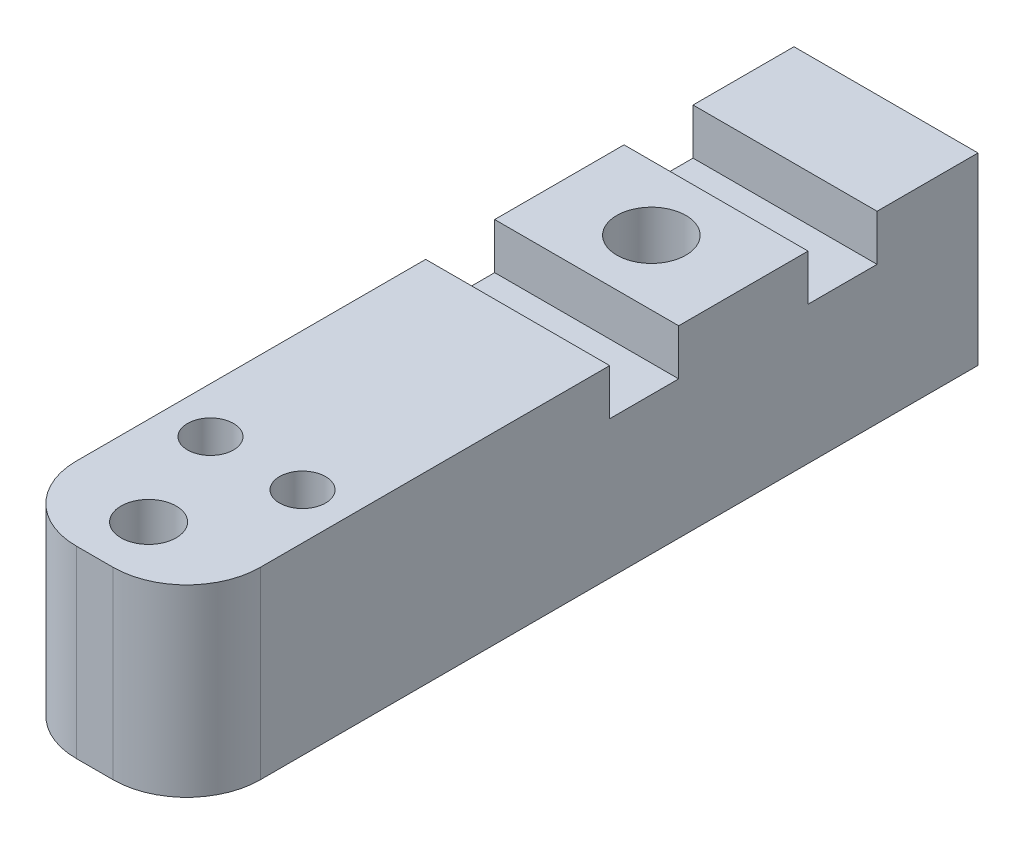
ISO-10303-21;
HEADER;
FILE_DESCRIPTION(('STEP AP214'),'2;1');
FILE_NAME('part.step','',(''),(''),'','','');
FILE_SCHEMA(('AUTOMOTIVE_DESIGN { 1 0 10303 214 1 1 1 1 }'));
ENDSEC;
DATA;
#1=APPLICATION_CONTEXT('core data for automotive mechanical design processes');
#2=APPLICATION_PROTOCOL_DEFINITION('international standard','automotive_design',2000,#1);
#3=PRODUCT_CONTEXT('',#1,'mechanical');
#4=PRODUCT('Part','Part','',(#3));
#5=PRODUCT_RELATED_PRODUCT_CATEGORY('part','',(#4));
#6=PRODUCT_DEFINITION_FORMATION('','',#4);
#7=PRODUCT_DEFINITION_CONTEXT('part definition',#1,'design');
#8=PRODUCT_DEFINITION('design','',#6,#7);
#9=PRODUCT_DEFINITION_SHAPE('','',#8);
#10=(LENGTH_UNIT() NAMED_UNIT(*) SI_UNIT(.MILLI.,.METRE.));
#11=(NAMED_UNIT(*) PLANE_ANGLE_UNIT() SI_UNIT($,.RADIAN.));
#12=(NAMED_UNIT(*) SI_UNIT($,.STERADIAN.) SOLID_ANGLE_UNIT());
#13=UNCERTAINTY_MEASURE_WITH_UNIT(LENGTH_MEASURE(1.E-05),#10,'distance_accuracy_value','');
#14=(GEOMETRIC_REPRESENTATION_CONTEXT(3) GLOBAL_UNCERTAINTY_ASSIGNED_CONTEXT((#13)) GLOBAL_UNIT_ASSIGNED_CONTEXT((#10,
#11,#12)) REPRESENTATION_CONTEXT('',''));
#15=CARTESIAN_POINT('',(0.,0.,0.));
#16=DIRECTION('',(0.,0.,1.));
#17=DIRECTION('',(1.,0.,0.));
#18=AXIS2_PLACEMENT_3D('',#15,#16,#17);
#19=CARTESIAN_POINT('',(-25.4,13.0503448275862,109.22));
#20=DIRECTION('',(0.,-1.,0.));
#21=DIRECTION('',(0.,0.,-1.));
#22=AXIS2_PLACEMENT_3D('',#19,#20,#21);
#23=PLANE('',#22);
#24=DIRECTION('',(0.,0.,-1.));
#25=VECTOR('',#24,1.);
#26=CARTESIAN_POINT('',(-25.4,13.0503448275862,109.22));
#27=LINE('',#26,#25);
#28=CARTESIAN_POINT('',(-25.4,13.0503448275862,13.9325404661232));
#29=VERTEX_POINT('',#28);
#30=CARTESIAN_POINT('',(-25.4,13.0503448275862,0.));
#31=VERTEX_POINT('',#30);
#32=EDGE_CURVE('E213',#29,#31,#27,.T.);
#33=ORIENTED_EDGE('',*,*,#32,.F.);
#34=DIRECTION('',(-1.,0.,0.));
#35=VECTOR('',#34,1.);
#36=CARTESIAN_POINT('',(0.,13.0503448275862,13.9325404661232));
#37=LINE('',#36,#35);
#38=CARTESIAN_POINT('',(0.,13.0503448275862,13.9325404661232));
#39=VERTEX_POINT('',#38);
#40=EDGE_CURVE('E151',#39,#29,#37,.T.);
#41=ORIENTED_EDGE('',*,*,#40,.F.);
#42=DIRECTION('',(0.,0.,-1.));
#43=VECTOR('',#42,1.);
#44=CARTESIAN_POINT('',(0.,13.0503448275862,109.22));
#45=LINE('',#44,#43);
#46=CARTESIAN_POINT('',(0.,13.0503448275862,0.));
#47=VERTEX_POINT('',#46);
#48=EDGE_CURVE('E226',#39,#47,#45,.T.);
#49=ORIENTED_EDGE('',*,*,#48,.T.);
#50=DIRECTION('',(-1.,0.,0.));
#51=VECTOR('',#50,1.);
#52=CARTESIAN_POINT('',(-25.4,13.0503448275862,0.));
#53=LINE('',#52,#51);
#54=EDGE_CURVE('E210',#47,#31,#53,.T.);
#55=ORIENTED_EDGE('',*,*,#54,.T.);
#56=EDGE_LOOP('',(#33,#41,#49,#55));
#57=FACE_BOUND('',#56,.T.);
#58=ADVANCED_FACE('F34',(#57),#23,.F.);
#59=CARTESIAN_POINT('',(-12.7,13.0503448275862,32.385));
#60=DIRECTION('',(0.,1.,0.));
#61=DIRECTION('',(0.,0.,1.));
#62=AXIS2_PLACEMENT_3D('',#59,#60,#61);
#63=CIRCLE('',#62,4.7625);
#64=CARTESIAN_POINT('',(-12.7,13.0503448275862,37.1475));
#65=VERTEX_POINT('',#64);
#66=EDGE_CURVE('E197',#65,#65,#63,.T.);
#67=ORIENTED_EDGE('',*,*,#66,.F.);
#68=EDGE_LOOP('',(#67));
#69=FACE_BOUND('',#68,.T.);
#70=CARTESIAN_POINT('',(0.,13.0503448275862,41.3124595338768));
#71=VERTEX_POINT('',#70);
#72=CARTESIAN_POINT('',(0.,13.0503448275862,23.4575404661232));
#73=VERTEX_POINT('',#72);
#74=EDGE_CURVE('E230',#71,#73,#45,.T.);
#75=ORIENTED_EDGE('',*,*,#74,.T.);
#76=DIRECTION('',(1.,0.,0.));
#77=VECTOR('',#76,1.);
#78=CARTESIAN_POINT('',(-25.4,13.0503448275862,23.4575404661232));
#79=LINE('',#78,#77);
#80=CARTESIAN_POINT('',(-25.4,13.0503448275862,23.4575404661232));
#81=VERTEX_POINT('',#80);
#82=EDGE_CURVE('E185',#81,#73,#79,.T.);
#83=ORIENTED_EDGE('',*,*,#82,.F.);
#84=CARTESIAN_POINT('',(-25.4,13.0503448275862,41.3124595338768));
#85=VERTEX_POINT('',#84);
#86=EDGE_CURVE('E157',#85,#81,#27,.T.);
#87=ORIENTED_EDGE('',*,*,#86,.F.);
#88=DIRECTION('',(-1.,0.,0.));
#89=VECTOR('',#88,1.);
#90=CARTESIAN_POINT('',(-25.4,13.0503448275862,41.3124595338768));
#91=LINE('',#90,#89);
#92=EDGE_CURVE('E178',#71,#85,#91,.T.);
#93=ORIENTED_EDGE('',*,*,#92,.F.);
#94=EDGE_LOOP('',(#75,#83,#87,#93));
#95=FACE_BOUND('',#94,.T.);
#96=ADVANCED_FACE('F270',(#69,#95),#23,.F.);
#97=CARTESIAN_POINT('',(-25.4,13.0503448275862,109.22));
#98=DIRECTION('',(1.,0.,0.));
#99=DIRECTION('',(0.,0.,-1.));
#100=AXIS2_PLACEMENT_3D('',#97,#98,#99);
#101=PLANE('',#100);
#102=DIRECTION('',(0.,0.,-1.));
#103=VECTOR('',#102,1.);
#104=CARTESIAN_POINT('',(-25.4,-12.3496551724138,109.22));
#105=LINE('',#104,#103);
#106=CARTESIAN_POINT('',(-25.4,-12.3496551724138,99.06));
#107=VERTEX_POINT('',#106);
#108=CARTESIAN_POINT('',(-25.4,-12.3496551724138,0.));
#109=VERTEX_POINT('',#108);
#110=EDGE_CURVE('E232',#107,#109,#105,.T.);
#111=ORIENTED_EDGE('',*,*,#110,.F.);
#112=DIRECTION('',(0.,-1.,0.));
#113=VECTOR('',#112,1.);
#114=CARTESIAN_POINT('',(-25.4,13.0503448275862,99.06));
#115=LINE('',#114,#113);
#116=CARTESIAN_POINT('',(-25.4,13.0503448275862,99.06));
#117=VERTEX_POINT('',#116);
#118=EDGE_CURVE('E42',#107,#117,#115,.F.);
#119=ORIENTED_EDGE('',*,*,#118,.T.);
#120=CARTESIAN_POINT('',(-25.4,13.0503448275862,50.8374595338768));
#121=VERTEX_POINT('',#120);
#122=EDGE_CURVE('E224',#117,#121,#27,.T.);
#123=ORIENTED_EDGE('',*,*,#122,.T.);
#124=DIRECTION('',(0.,1.,0.));
#125=VECTOR('',#124,1.);
#126=CARTESIAN_POINT('',(-25.4,6.7003448275862,50.8374595338768));
#127=LINE('',#126,#125);
#128=CARTESIAN_POINT('',(-25.4,6.7003448275862,50.8374595338768));
#129=VERTEX_POINT('',#128);
#130=EDGE_CURVE('E189',#129,#121,#127,.T.);
#131=ORIENTED_EDGE('',*,*,#130,.F.);
#132=DIRECTION('',(0.,0.,1.));
#133=VECTOR('',#132,1.);
#134=CARTESIAN_POINT('',(-25.4,6.7003448275862,50.8374595338768));
#135=LINE('',#134,#133);
#136=CARTESIAN_POINT('',(-25.4,6.7003448275862,41.3124595338768));
#137=VERTEX_POINT('',#136);
#138=EDGE_CURVE('E167',#137,#129,#135,.T.);
#139=ORIENTED_EDGE('',*,*,#138,.F.);
#140=DIRECTION('',(0.,1.,0.));
#141=VECTOR('',#140,1.);
#142=CARTESIAN_POINT('',(-25.4,6.7003448275862,41.3124595338768));
#143=LINE('',#142,#141);
#144=EDGE_CURVE('E177',#137,#85,#143,.T.);
#145=ORIENTED_EDGE('',*,*,#144,.T.);
#146=ORIENTED_EDGE('',*,*,#86,.T.);
#147=DIRECTION('',(0.,1.,0.));
#148=VECTOR('',#147,1.);
#149=CARTESIAN_POINT('',(-25.4,6.7003448275862,23.4575404661232));
#150=LINE('',#149,#148);
#151=CARTESIAN_POINT('',(-25.4,6.7003448275862,23.4575404661232));
#152=VERTEX_POINT('',#151);
#153=EDGE_CURVE('E136',#152,#81,#150,.T.);
#154=ORIENTED_EDGE('',*,*,#153,.F.);
#155=DIRECTION('',(0.,0.,1.));
#156=VECTOR('',#155,1.);
#157=CARTESIAN_POINT('',(-25.4,6.7003448275862,13.9325404661232));
#158=LINE('',#157,#156);
#159=CARTESIAN_POINT('',(-25.4,6.7003448275862,13.9325404661232));
#160=VERTEX_POINT('',#159);
#161=EDGE_CURVE('E143',#160,#152,#158,.T.);
#162=ORIENTED_EDGE('',*,*,#161,.F.);
#163=DIRECTION('',(0.,1.,0.));
#164=VECTOR('',#163,1.);
#165=CARTESIAN_POINT('',(-25.4,6.7003448275862,13.9325404661232));
#166=LINE('',#165,#164);
#167=EDGE_CURVE('E200',#160,#29,#166,.T.);
#168=ORIENTED_EDGE('',*,*,#167,.T.);
#169=ORIENTED_EDGE('',*,*,#32,.T.);
#170=DIRECTION('',(0.,-1.,0.));
#171=VECTOR('',#170,1.);
#172=CARTESIAN_POINT('',(-25.4,13.0503448275862,0.));
#173=LINE('',#172,#171);
#174=EDGE_CURVE('E204',#31,#109,#173,.T.);
#175=ORIENTED_EDGE('',*,*,#174,.T.);
#176=EDGE_LOOP('',(#111,#119,#123,#131,#139,#145,#146,#154,#162,#168,#169,#175));
#177=FACE_BOUND('',#176,.T.);
#178=ADVANCED_FACE('F154',(#177),#101,.F.);
#179=CARTESIAN_POINT('',(-25.4,-12.3496551724138,109.22));
#180=DIRECTION('',(0.,1.,0.));
#181=DIRECTION('',(0.,0.,1.));
#182=AXIS2_PLACEMENT_3D('',#179,#180,#181);
#183=PLANE('',#182);
#184=CARTESIAN_POINT('',(-19.05,-12.3496551724138,86.8843216073793));
#185=DIRECTION('',(0.,1.,0.));
#186=DIRECTION('',(0.,0.,1.));
#187=AXIS2_PLACEMENT_3D('',#184,#185,#186);
#188=CIRCLE('',#187,3.175);
#189=CARTESIAN_POINT('',(-19.05,-12.3496551724138,90.0593216073793));
#190=VERTEX_POINT('',#189);
#191=EDGE_CURVE('E180',#190,#190,#188,.T.);
#192=ORIENTED_EDGE('',*,*,#191,.T.);
#193=EDGE_LOOP('',(#192));
#194=FACE_BOUND('',#193,.T.);
#195=CARTESIAN_POINT('',(-6.35,-12.3496551724138,86.8843216073793));
#196=DIRECTION('',(0.,1.,0.));
#197=DIRECTION('',(0.,0.,1.));
#198=AXIS2_PLACEMENT_3D('',#195,#196,#197);
#199=CIRCLE('',#198,3.175);
#200=CARTESIAN_POINT('',(-6.35,-12.3496551724138,90.0593216073793));
#201=VERTEX_POINT('',#200);
#202=EDGE_CURVE('E302',#201,#201,#199,.T.);
#203=ORIENTED_EDGE('',*,*,#202,.T.);
#204=EDGE_LOOP('',(#203));
#205=FACE_BOUND('',#204,.T.);
#206=CARTESIAN_POINT('',(-12.7,-12.3496551724138,32.385));
#207=DIRECTION('',(0.,1.,0.));
#208=DIRECTION('',(0.,0.,1.));
#209=AXIS2_PLACEMENT_3D('',#206,#207,#208);
#210=CIRCLE('',#209,4.7625);
#211=CARTESIAN_POINT('',(-12.7,-12.3496551724138,37.1475));
#212=VERTEX_POINT('',#211);
#213=EDGE_CURVE('E193',#212,#212,#210,.T.);
#214=ORIENTED_EDGE('',*,*,#213,.T.);
#215=EDGE_LOOP('',(#214));
#216=FACE_BOUND('',#215,.T.);
#217=DIRECTION('',(1.,0.,0.));
#218=VECTOR('',#217,1.);
#219=CARTESIAN_POINT('',(-25.4,-12.3496551724138,109.22));
#220=LINE('',#219,#218);
#221=CARTESIAN_POINT('',(-15.24,-12.3496551724138,109.22));
#222=VERTEX_POINT('',#221);
#223=CARTESIAN_POINT('',(-10.16,-12.3496551724138,109.22));
#224=VERTEX_POINT('',#223);
#225=EDGE_CURVE('E207',#222,#224,#220,.T.);
#226=ORIENTED_EDGE('',*,*,#225,.F.);
#227=CARTESIAN_POINT('',(-15.24,-12.3496551724138,99.06));
#228=DIRECTION('',(0.,1.,0.));
#229=DIRECTION('',(0.,0.,1.));
#230=AXIS2_PLACEMENT_3D('',#227,#228,#229);
#231=CIRCLE('',#230,10.16);
#232=EDGE_CURVE('E56',#222,#107,#231,.F.);
#233=ORIENTED_EDGE('',*,*,#232,.T.);
#234=ORIENTED_EDGE('',*,*,#110,.T.);
#235=DIRECTION('',(1.,0.,0.));
#236=VECTOR('',#235,1.);
#237=CARTESIAN_POINT('',(-25.4,-12.3496551724138,0.));
#238=LINE('',#237,#236);
#239=CARTESIAN_POINT('',(0.,-12.3496551724138,0.));
#240=VERTEX_POINT('',#239);
#241=EDGE_CURVE('E216',#109,#240,#238,.T.);
#242=ORIENTED_EDGE('',*,*,#241,.T.);
#243=DIRECTION('',(0.,0.,-1.));
#244=VECTOR('',#243,1.);
#245=CARTESIAN_POINT('',(0.,-12.3496551724138,109.22));
#246=LINE('',#245,#244);
#247=CARTESIAN_POINT('',(0.,-12.3496551724138,99.06));
#248=VERTEX_POINT('',#247);
#249=EDGE_CURVE('E229',#248,#240,#246,.T.);
#250=ORIENTED_EDGE('',*,*,#249,.F.);
#251=CARTESIAN_POINT('',(-10.16,-12.3496551724138,99.06));
#252=DIRECTION('',(0.,1.,0.));
#253=DIRECTION('',(0.,0.,1.));
#254=AXIS2_PLACEMENT_3D('',#251,#252,#253);
#255=CIRCLE('',#254,10.16);
#256=EDGE_CURVE('E241',#248,#224,#255,.F.);
#257=ORIENTED_EDGE('',*,*,#256,.T.);
#258=EDGE_LOOP('',(#226,#233,#234,#242,#250,#257));
#259=FACE_BOUND('',#258,.T.);
#260=ADVANCED_FACE('F253',(#194,#205,#216,#259),#183,.F.);
#261=CARTESIAN_POINT('',(0.,13.0503448275862,109.22));
#262=DIRECTION('',(-1.,0.,0.));
#263=DIRECTION('',(0.,-1.,0.));
#264=AXIS2_PLACEMENT_3D('',#261,#262,#263);
#265=PLANE('',#264);
#266=CARTESIAN_POINT('',(0.,13.0503448275862,99.06));
#267=VERTEX_POINT('',#266);
#268=CARTESIAN_POINT('',(0.,13.0503448275862,50.8374595338768));
#269=VERTEX_POINT('',#268);
#270=EDGE_CURVE('E227',#267,#269,#45,.T.);
#271=ORIENTED_EDGE('',*,*,#270,.F.);
#272=DIRECTION('',(0.,1.,0.));
#273=VECTOR('',#272,1.);
#274=CARTESIAN_POINT('',(0.,-12.3496551724138,99.06));
#275=LINE('',#274,#273);
#276=EDGE_CURVE('E239',#267,#248,#275,.F.);
#277=ORIENTED_EDGE('',*,*,#276,.T.);
#278=ORIENTED_EDGE('',*,*,#249,.T.);
#279=DIRECTION('',(0.,1.,0.));
#280=VECTOR('',#279,1.);
#281=CARTESIAN_POINT('',(0.,13.0503448275862,0.));
#282=LINE('',#281,#280);
#283=EDGE_CURVE('E219',#240,#47,#282,.T.);
#284=ORIENTED_EDGE('',*,*,#283,.T.);
#285=ORIENTED_EDGE('',*,*,#48,.F.);
#286=DIRECTION('',(0.,1.,0.));
#287=VECTOR('',#286,1.);
#288=CARTESIAN_POINT('',(0.,6.7003448275862,13.9325404661232));
#289=LINE('',#288,#287);
#290=CARTESIAN_POINT('',(0.,6.7003448275862,13.9325404661232));
#291=VERTEX_POINT('',#290);
#292=EDGE_CURVE('E159',#291,#39,#289,.T.);
#293=ORIENTED_EDGE('',*,*,#292,.F.);
#294=DIRECTION('',(0.,0.,-1.));
#295=VECTOR('',#294,1.);
#296=CARTESIAN_POINT('',(0.,6.7003448275862,23.4575404661232));
#297=LINE('',#296,#295);
#298=CARTESIAN_POINT('',(0.,6.7003448275862,23.4575404661232));
#299=VERTEX_POINT('',#298);
#300=EDGE_CURVE('E142',#299,#291,#297,.T.);
#301=ORIENTED_EDGE('',*,*,#300,.F.);
#302=DIRECTION('',(0.,1.,0.));
#303=VECTOR('',#302,1.);
#304=CARTESIAN_POINT('',(0.,6.7003448275862,23.4575404661232));
#305=LINE('',#304,#303);
#306=EDGE_CURVE('E139',#299,#73,#305,.T.);
#307=ORIENTED_EDGE('',*,*,#306,.T.);
#308=ORIENTED_EDGE('',*,*,#74,.F.);
#309=DIRECTION('',(0.,1.,0.));
#310=VECTOR('',#309,1.);
#311=CARTESIAN_POINT('',(0.,6.7003448275862,41.3124595338768));
#312=LINE('',#311,#310);
#313=CARTESIAN_POINT('',(0.,6.7003448275862,41.3124595338768));
#314=VERTEX_POINT('',#313);
#315=EDGE_CURVE('E183',#314,#71,#312,.T.);
#316=ORIENTED_EDGE('',*,*,#315,.F.);
#317=DIRECTION('',(0.,0.,-1.));
#318=VECTOR('',#317,1.);
#319=CARTESIAN_POINT('',(0.,6.7003448275862,41.3124595338768));
#320=LINE('',#319,#318);
#321=CARTESIAN_POINT('',(0.,6.7003448275862,50.8374595338768));
#322=VERTEX_POINT('',#321);
#323=EDGE_CURVE('E174',#322,#314,#320,.T.);
#324=ORIENTED_EDGE('',*,*,#323,.F.);
#325=DIRECTION('',(0.,1.,0.));
#326=VECTOR('',#325,1.);
#327=CARTESIAN_POINT('',(0.,6.7003448275862,50.8374595338768));
#328=LINE('',#327,#326);
#329=EDGE_CURVE('E186',#322,#269,#328,.T.);
#330=ORIENTED_EDGE('',*,*,#329,.T.);
#331=EDGE_LOOP('',(#271,#277,#278,#284,#285,#293,#301,#307,#308,#316,#324,#330));
#332=FACE_BOUND('',#331,.T.);
#333=ADVANCED_FACE('F281',(#332),#265,.F.);
#334=CARTESIAN_POINT('',(-13.1359477203027,13.0503448275862,101.346));
#335=DIRECTION('',(0.,1.,0.));
#336=DIRECTION('',(0.,0.,1.));
#337=AXIS2_PLACEMENT_3D('',#334,#335,#336);
#338=CIRCLE('',#337,3.81);
#339=CARTESIAN_POINT('',(-13.1359477203027,13.0503448275862,105.156));
#340=VERTEX_POINT('',#339);
#341=EDGE_CURVE('E293',#340,#340,#338,.T.);
#342=ORIENTED_EDGE('',*,*,#341,.F.);
#343=EDGE_LOOP('',(#342));
#344=FACE_BOUND('',#343,.T.);
#345=CARTESIAN_POINT('',(-19.05,13.0503448275862,86.8843216073793));
#346=DIRECTION('',(0.,1.,0.));
#347=DIRECTION('',(0.,0.,1.));
#348=AXIS2_PLACEMENT_3D('',#345,#346,#347);
#349=CIRCLE('',#348,3.175);
#350=CARTESIAN_POINT('',(-19.05,13.0503448275862,90.0593216073793));
#351=VERTEX_POINT('',#350);
#352=EDGE_CURVE('E297',#351,#351,#349,.T.);
#353=ORIENTED_EDGE('',*,*,#352,.F.);
#354=EDGE_LOOP('',(#353));
#355=FACE_BOUND('',#354,.T.);
#356=CARTESIAN_POINT('',(-6.35,13.0503448275862,86.8843216073793));
#357=DIRECTION('',(0.,1.,0.));
#358=DIRECTION('',(0.,0.,1.));
#359=AXIS2_PLACEMENT_3D('',#356,#357,#358);
#360=CIRCLE('',#359,3.175);
#361=CARTESIAN_POINT('',(-6.35,13.0503448275862,90.0593216073793));
#362=VERTEX_POINT('',#361);
#363=EDGE_CURVE('E300',#362,#362,#360,.T.);
#364=ORIENTED_EDGE('',*,*,#363,.F.);
#365=EDGE_LOOP('',(#364));
#366=FACE_BOUND('',#365,.T.);
#367=ORIENTED_EDGE('',*,*,#122,.F.);
#368=CARTESIAN_POINT('',(-15.24,13.0503448275862,99.06));
#369=DIRECTION('',(0.,-1.,0.));
#370=DIRECTION('',(0.,0.,-1.));
#371=AXIS2_PLACEMENT_3D('',#368,#369,#370);
#372=CIRCLE('',#371,10.16);
#373=CARTESIAN_POINT('',(-15.24,13.0503448275862,109.22));
#374=VERTEX_POINT('',#373);
#375=EDGE_CURVE('E11',#117,#374,#372,.F.);
#376=ORIENTED_EDGE('',*,*,#375,.T.);
#377=DIRECTION('',(-1.,0.,0.));
#378=VECTOR('',#377,1.);
#379=CARTESIAN_POINT('',(-25.4,13.0503448275862,109.22));
#380=LINE('',#379,#378);
#381=CARTESIAN_POINT('',(-10.16,13.0503448275862,109.22));
#382=VERTEX_POINT('',#381);
#383=EDGE_CURVE('E209',#382,#374,#380,.T.);
#384=ORIENTED_EDGE('',*,*,#383,.F.);
#385=CARTESIAN_POINT('',(-10.16,13.0503448275862,99.06));
#386=DIRECTION('',(0.,-1.,0.));
#387=DIRECTION('',(0.,0.,-1.));
#388=AXIS2_PLACEMENT_3D('',#385,#386,#387);
#389=CIRCLE('',#388,10.16);
#390=EDGE_CURVE('E237',#382,#267,#389,.F.);
#391=ORIENTED_EDGE('',*,*,#390,.T.);
#392=ORIENTED_EDGE('',*,*,#270,.T.);
#393=DIRECTION('',(1.,0.,0.));
#394=VECTOR('',#393,1.);
#395=CARTESIAN_POINT('',(0.,13.0503448275862,50.8374595338768));
#396=LINE('',#395,#394);
#397=EDGE_CURVE('E168',#121,#269,#396,.T.);
#398=ORIENTED_EDGE('',*,*,#397,.F.);
#399=EDGE_LOOP('',(#367,#376,#384,#391,#392,#398));
#400=FACE_BOUND('',#399,.T.);
#401=ADVANCED_FACE('F261',(#344,#355,#366,#400),#23,.F.);
#402=CARTESIAN_POINT('',(0.,0.,109.22));
#403=DIRECTION('',(0.,0.,1.));
#404=DIRECTION('',(1.,0.,0.));
#405=AXIS2_PLACEMENT_3D('',#402,#403,#404);
#406=PLANE('',#405);
#407=ORIENTED_EDGE('',*,*,#383,.T.);
#408=DIRECTION('',(0.,-1.,0.));
#409=VECTOR('',#408,1.);
#410=CARTESIAN_POINT('',(-15.24,-12.3496551724138,109.22));
#411=LINE('',#410,#409);
#412=EDGE_CURVE('E244',#374,#222,#411,.T.);
#413=ORIENTED_EDGE('',*,*,#412,.T.);
#414=ORIENTED_EDGE('',*,*,#225,.T.);
#415=DIRECTION('',(0.,1.,0.));
#416=VECTOR('',#415,1.);
#417=CARTESIAN_POINT('',(-10.16,13.0503448275862,109.22));
#418=LINE('',#417,#416);
#419=EDGE_CURVE('E234',#224,#382,#418,.T.);
#420=ORIENTED_EDGE('',*,*,#419,.T.);
#421=EDGE_LOOP('',(#407,#413,#414,#420));
#422=FACE_BOUND('',#421,.T.);
#423=ADVANCED_FACE('F249',(#422),#406,.T.);
#424=CARTESIAN_POINT('',(0.,0.,0.));
#425=DIRECTION('',(0.,0.,1.));
#426=DIRECTION('',(1.,0.,0.));
#427=AXIS2_PLACEMENT_3D('',#424,#425,#426);
#428=PLANE('',#427);
#429=CARTESIAN_POINT('',(-12.7,0.,0.));
#430=DIRECTION('',(0.,0.,-1.));
#431=DIRECTION('',(-1.,0.,0.));
#432=AXIS2_PLACEMENT_3D('',#429,#430,#431);
#433=CIRCLE('',#432,2.54);
#434=CARTESIAN_POINT('',(-15.24,0.,0.));
#435=VERTEX_POINT('',#434);
#436=EDGE_CURVE('E196',#435,#435,#433,.T.);
#437=ORIENTED_EDGE('',*,*,#436,.F.);
#438=EDGE_LOOP('',(#437));
#439=FACE_BOUND('',#438,.T.);
#440=ORIENTED_EDGE('',*,*,#174,.F.);
#441=ORIENTED_EDGE('',*,*,#54,.F.);
#442=ORIENTED_EDGE('',*,*,#283,.F.);
#443=ORIENTED_EDGE('',*,*,#241,.F.);
#444=EDGE_LOOP('',(#440,#441,#442,#443));
#445=FACE_BOUND('',#444,.T.);
#446=ADVANCED_FACE('F287',(#439,#445),#428,.F.);
#447=CARTESIAN_POINT('',(-12.7,0.,17.78));
#448=DIRECTION('',(0.,0.,-1.));
#449=DIRECTION('',(-1.,0.,0.));
#450=AXIS2_PLACEMENT_3D('',#447,#448,#449);
#451=CYLINDRICAL_SURFACE('',#450,2.54);
#452=CARTESIAN_POINT('',(-12.7,0.,17.78));
#453=DIRECTION('',(0.,0.,-1.));
#454=DIRECTION('',(-1.,0.,0.));
#455=AXIS2_PLACEMENT_3D('',#452,#453,#454);
#456=CIRCLE('',#455,2.54);
#457=CARTESIAN_POINT('',(-15.24,0.,17.78));
#458=VERTEX_POINT('',#457);
#459=EDGE_CURVE('E201',#458,#458,#456,.T.);
#460=ORIENTED_EDGE('',*,*,#459,.F.);
#461=EDGE_LOOP('',(#460));
#462=FACE_BOUND('',#461,.T.);
#463=ORIENTED_EDGE('',*,*,#436,.T.);
#464=EDGE_LOOP('',(#463));
#465=FACE_BOUND('',#464,.T.);
#466=ADVANCED_FACE('F339',(#462,#465),#451,.F.);
#467=CARTESIAN_POINT('',(-12.7,0.,17.78));
#468=DIRECTION('',(0.,0.,-1.));
#469=DIRECTION('',(-1.,0.,0.));
#470=AXIS2_PLACEMENT_3D('',#467,#468,#469);
#471=PLANE('',#470);
#472=ORIENTED_EDGE('',*,*,#459,.T.);
#473=EDGE_LOOP('',(#472));
#474=FACE_BOUND('',#473,.T.);
#475=ADVANCED_FACE('F344',(#474),#471,.T.);
#476=CARTESIAN_POINT('',(-12.7,-12.3496551724138,32.385));
#477=DIRECTION('',(0.,1.,0.));
#478=DIRECTION('',(0.,0.,1.));
#479=AXIS2_PLACEMENT_3D('',#476,#477,#478);
#480=CYLINDRICAL_SURFACE('',#479,4.7625);
#481=ORIENTED_EDGE('',*,*,#213,.F.);
#482=EDGE_LOOP('',(#481));
#483=FACE_BOUND('',#482,.T.);
#484=ORIENTED_EDGE('',*,*,#66,.T.);
#485=EDGE_LOOP('',(#484));
#486=FACE_BOUND('',#485,.T.);
#487=ADVANCED_FACE('F351',(#483,#486),#480,.F.);
#488=CARTESIAN_POINT('',(-25.4,6.7003448275862,41.3124595338768));
#489=DIRECTION('',(0.,0.,-1.));
#490=DIRECTION('',(-1.,0.,0.));
#491=AXIS2_PLACEMENT_3D('',#488,#489,#490);
#492=PLANE('',#491);
#493=ORIENTED_EDGE('',*,*,#92,.T.);
#494=ORIENTED_EDGE('',*,*,#144,.F.);
#495=DIRECTION('',(-1.,0.,0.));
#496=VECTOR('',#495,1.);
#497=CARTESIAN_POINT('',(-25.4,6.7003448275862,41.3124595338768));
#498=LINE('',#497,#496);
#499=EDGE_CURVE('E164',#314,#137,#498,.T.);
#500=ORIENTED_EDGE('',*,*,#499,.F.);
#501=ORIENTED_EDGE('',*,*,#315,.T.);
#502=EDGE_LOOP('',(#493,#494,#500,#501));
#503=FACE_BOUND('',#502,.T.);
#504=ADVANCED_FACE('F328',(#503),#492,.F.);
#505=CARTESIAN_POINT('',(0.,6.7003448275862,50.8374595338768));
#506=DIRECTION('',(0.,0.,1.));
#507=DIRECTION('',(1.,0.,0.));
#508=AXIS2_PLACEMENT_3D('',#505,#506,#507);
#509=PLANE('',#508);
#510=ORIENTED_EDGE('',*,*,#397,.T.);
#511=ORIENTED_EDGE('',*,*,#329,.F.);
#512=DIRECTION('',(1.,0.,0.));
#513=VECTOR('',#512,1.);
#514=CARTESIAN_POINT('',(0.,6.7003448275862,50.8374595338768));
#515=LINE('',#514,#513);
#516=EDGE_CURVE('E171',#129,#322,#515,.T.);
#517=ORIENTED_EDGE('',*,*,#516,.F.);
#518=ORIENTED_EDGE('',*,*,#130,.T.);
#519=EDGE_LOOP('',(#510,#511,#517,#518));
#520=FACE_BOUND('',#519,.T.);
#521=ADVANCED_FACE('F334',(#520),#509,.F.);
#522=CARTESIAN_POINT('',(0.,6.7003448275862,0.));
#523=DIRECTION('',(0.,-1.,0.));
#524=DIRECTION('',(0.,0.,-1.));
#525=AXIS2_PLACEMENT_3D('',#522,#523,#524);
#526=PLANE('',#525);
#527=ORIENTED_EDGE('',*,*,#499,.T.);
#528=ORIENTED_EDGE('',*,*,#138,.T.);
#529=ORIENTED_EDGE('',*,*,#516,.T.);
#530=ORIENTED_EDGE('',*,*,#323,.T.);
#531=EDGE_LOOP('',(#527,#528,#529,#530));
#532=FACE_BOUND('',#531,.T.);
#533=ADVANCED_FACE('F331',(#532),#526,.F.);
#534=CARTESIAN_POINT('',(0.,6.7003448275862,13.9325404661232));
#535=DIRECTION('',(0.,0.,-1.));
#536=DIRECTION('',(-1.,0.,0.));
#537=AXIS2_PLACEMENT_3D('',#534,#535,#536);
#538=PLANE('',#537);
#539=ORIENTED_EDGE('',*,*,#40,.T.);
#540=ORIENTED_EDGE('',*,*,#167,.F.);
#541=DIRECTION('',(-1.,0.,0.));
#542=VECTOR('',#541,1.);
#543=CARTESIAN_POINT('',(0.,6.7003448275862,13.9325404661232));
#544=LINE('',#543,#542);
#545=EDGE_CURVE('E149',#291,#160,#544,.T.);
#546=ORIENTED_EDGE('',*,*,#545,.F.);
#547=ORIENTED_EDGE('',*,*,#292,.T.);
#548=EDGE_LOOP('',(#539,#540,#546,#547));
#549=FACE_BOUND('',#548,.T.);
#550=ADVANCED_FACE('F317',(#549),#538,.F.);
#551=CARTESIAN_POINT('',(-25.4,6.7003448275862,23.4575404661232));
#552=DIRECTION('',(0.,0.,1.));
#553=DIRECTION('',(1.,0.,0.));
#554=AXIS2_PLACEMENT_3D('',#551,#552,#553);
#555=PLANE('',#554);
#556=ORIENTED_EDGE('',*,*,#82,.T.);
#557=ORIENTED_EDGE('',*,*,#306,.F.);
#558=DIRECTION('',(1.,0.,0.));
#559=VECTOR('',#558,1.);
#560=CARTESIAN_POINT('',(-25.4,6.7003448275862,23.4575404661232));
#561=LINE('',#560,#559);
#562=EDGE_CURVE('E132',#152,#299,#561,.T.);
#563=ORIENTED_EDGE('',*,*,#562,.F.);
#564=ORIENTED_EDGE('',*,*,#153,.T.);
#565=EDGE_LOOP('',(#556,#557,#563,#564));
#566=FACE_BOUND('',#565,.T.);
#567=ADVANCED_FACE('F134',(#566),#555,.F.);
#568=CARTESIAN_POINT('',(0.,6.7003448275862,0.));
#569=DIRECTION('',(0.,1.,0.));
#570=DIRECTION('',(0.,0.,1.));
#571=AXIS2_PLACEMENT_3D('',#568,#569,#570);
#572=PLANE('',#571);
#573=ORIENTED_EDGE('',*,*,#161,.T.);
#574=ORIENTED_EDGE('',*,*,#562,.T.);
#575=ORIENTED_EDGE('',*,*,#300,.T.);
#576=ORIENTED_EDGE('',*,*,#545,.T.);
#577=EDGE_LOOP('',(#573,#574,#575,#576));
#578=FACE_BOUND('',#577,.T.);
#579=ADVANCED_FACE('F147',(#578),#572,.T.);
#580=CARTESIAN_POINT('',(-6.35,-12.3496551724138,86.8843216073793));
#581=DIRECTION('',(0.,1.,0.));
#582=DIRECTION('',(0.,0.,1.));
#583=AXIS2_PLACEMENT_3D('',#580,#581,#582);
#584=CYLINDRICAL_SURFACE('',#583,3.175);
#585=ORIENTED_EDGE('',*,*,#202,.F.);
#586=EDGE_LOOP('',(#585));
#587=FACE_BOUND('',#586,.T.);
#588=ORIENTED_EDGE('',*,*,#363,.T.);
#589=EDGE_LOOP('',(#588));
#590=FACE_BOUND('',#589,.T.);
#591=ADVANCED_FACE('F368',(#587,#590),#584,.F.);
#592=CARTESIAN_POINT('',(-19.05,-12.3496551724138,86.8843216073793));
#593=DIRECTION('',(0.,1.,0.));
#594=DIRECTION('',(0.,0.,1.));
#595=AXIS2_PLACEMENT_3D('',#592,#593,#594);
#596=CYLINDRICAL_SURFACE('',#595,3.175);
#597=ORIENTED_EDGE('',*,*,#191,.F.);
#598=EDGE_LOOP('',(#597));
#599=FACE_BOUND('',#598,.T.);
#600=ORIENTED_EDGE('',*,*,#352,.T.);
#601=EDGE_LOOP('',(#600));
#602=FACE_BOUND('',#601,.T.);
#603=ADVANCED_FACE('F371',(#599,#602),#596,.F.);
#604=CARTESIAN_POINT('',(-13.1359477203027,-3.4596551724138,101.346));
#605=DIRECTION('',(0.,1.,0.));
#606=DIRECTION('',(0.,0.,1.));
#607=AXIS2_PLACEMENT_3D('',#604,#605,#606);
#608=CYLINDRICAL_SURFACE('',#607,3.81);
#609=CARTESIAN_POINT('',(-13.1359477203027,-3.4596551724138,101.346));
#610=DIRECTION('',(0.,1.,0.));
#611=DIRECTION('',(0.,0.,1.));
#612=AXIS2_PLACEMENT_3D('',#609,#610,#611);
#613=CIRCLE('',#612,3.81);
#614=CARTESIAN_POINT('',(-13.1359477203027,-3.4596551724138,105.156));
#615=VERTEX_POINT('',#614);
#616=EDGE_CURVE('E303',#615,#615,#613,.T.);
#617=ORIENTED_EDGE('',*,*,#616,.F.);
#618=EDGE_LOOP('',(#617));
#619=FACE_BOUND('',#618,.T.);
#620=ORIENTED_EDGE('',*,*,#341,.T.);
#621=EDGE_LOOP('',(#620));
#622=FACE_BOUND('',#621,.T.);
#623=ADVANCED_FACE('F375',(#619,#622),#608,.F.);
#624=CARTESIAN_POINT('',(-13.1359477203027,-3.4596551724138,101.346));
#625=DIRECTION('',(0.,1.,0.));
#626=DIRECTION('',(0.,0.,1.));
#627=AXIS2_PLACEMENT_3D('',#624,#625,#626);
#628=PLANE('',#627);
#629=ORIENTED_EDGE('',*,*,#616,.T.);
#630=EDGE_LOOP('',(#629));
#631=FACE_BOUND('',#630,.T.);
#632=ADVANCED_FACE('F268',(#631),#628,.T.);
#633=CARTESIAN_POINT('',(-10.16,0.,99.06));
#634=DIRECTION('',(0.,-1.,0.));
#635=DIRECTION('',(1.,0.,0.));
#636=AXIS2_PLACEMENT_3D('',#633,#634,#635);
#637=CYLINDRICAL_SURFACE('',#636,10.16);
#638=ORIENTED_EDGE('',*,*,#256,.F.);
#639=ORIENTED_EDGE('',*,*,#276,.F.);
#640=ORIENTED_EDGE('',*,*,#390,.F.);
#641=ORIENTED_EDGE('',*,*,#419,.F.);
#642=EDGE_LOOP('',(#638,#639,#640,#641));
#643=FACE_BOUND('',#642,.T.);
#644=ADVANCED_FACE('F259',(#643),#637,.T.);
#645=CARTESIAN_POINT('',(-15.24,0.,99.06));
#646=DIRECTION('',(0.,1.,0.));
#647=DIRECTION('',(0.,0.,1.));
#648=AXIS2_PLACEMENT_3D('',#645,#646,#647);
#649=CYLINDRICAL_SURFACE('',#648,10.16);
#650=ORIENTED_EDGE('',*,*,#375,.F.);
#651=ORIENTED_EDGE('',*,*,#118,.F.);
#652=ORIENTED_EDGE('',*,*,#232,.F.);
#653=ORIENTED_EDGE('',*,*,#412,.F.);
#654=EDGE_LOOP('',(#650,#651,#652,#653));
#655=FACE_BOUND('',#654,.T.);
#656=ADVANCED_FACE('F36',(#655),#649,.T.);
#657=CLOSED_SHELL('',(#58,#96,#178,#260,#333,#401,#423,#446,#466,#475,#487,#504,#521,#533,#550,
#567,#579,#591,#603,#623,#632,#644,#656));
#658=MANIFOLD_SOLID_BREP('B2',#657);
#659=ADVANCED_BREP_SHAPE_REPRESENTATION('',(#18,#658),#14);
#660=SHAPE_DEFINITION_REPRESENTATION(#9,#659);
ENDSEC;
END-ISO-10303-21;
